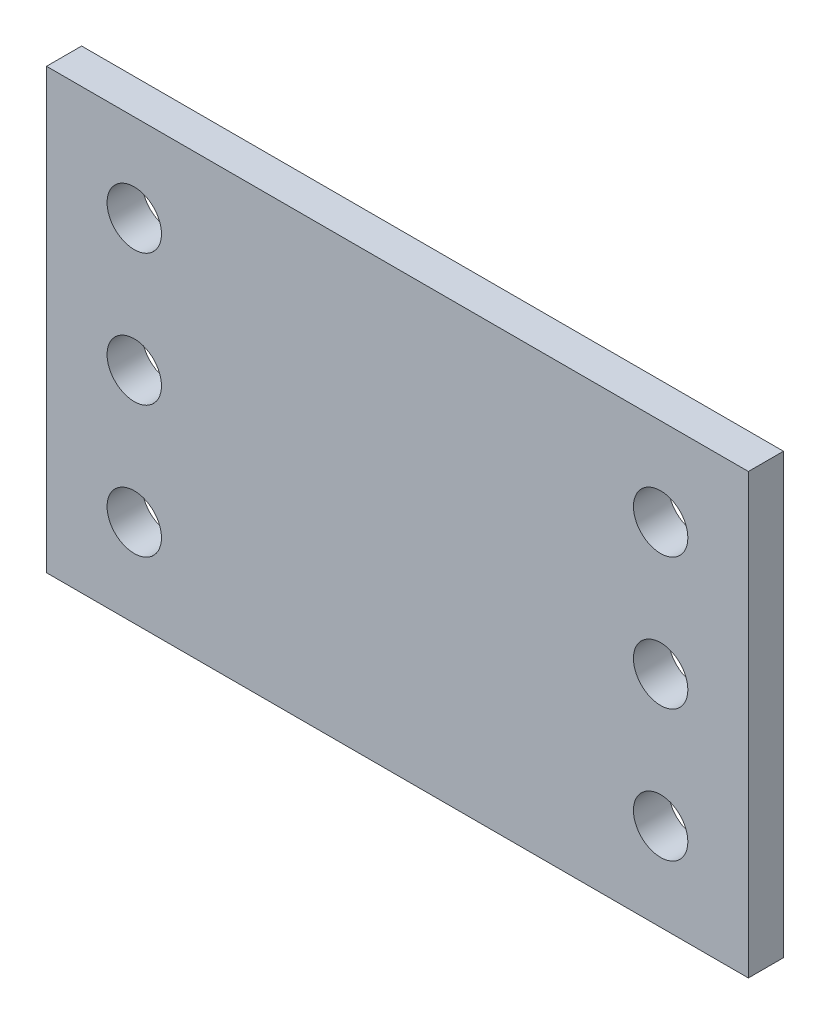
ISO-10303-21;
HEADER;
FILE_DESCRIPTION(('STEP AP214'),'2;1');
FILE_NAME('part.step','',(''),(''),'','','');
FILE_SCHEMA(('AUTOMOTIVE_DESIGN { 1 0 10303 214 1 1 1 1 }'));
ENDSEC;
DATA;
#1=APPLICATION_CONTEXT('core data for automotive mechanical design processes');
#2=APPLICATION_PROTOCOL_DEFINITION('international standard','automotive_design',2000,#1);
#3=PRODUCT_CONTEXT('',#1,'mechanical');
#4=PRODUCT('Part','Part','',(#3));
#5=PRODUCT_RELATED_PRODUCT_CATEGORY('part','',(#4));
#6=PRODUCT_DEFINITION_FORMATION('','',#4);
#7=PRODUCT_DEFINITION_CONTEXT('part definition',#1,'design');
#8=PRODUCT_DEFINITION('design','',#6,#7);
#9=PRODUCT_DEFINITION_SHAPE('','',#8);
#10=(LENGTH_UNIT() NAMED_UNIT(*) SI_UNIT(.MILLI.,.METRE.));
#11=(NAMED_UNIT(*) PLANE_ANGLE_UNIT() SI_UNIT($,.RADIAN.));
#12=(NAMED_UNIT(*) SI_UNIT($,.STERADIAN.) SOLID_ANGLE_UNIT());
#13=UNCERTAINTY_MEASURE_WITH_UNIT(LENGTH_MEASURE(1.E-05),#10,'distance_accuracy_value','');
#14=(GEOMETRIC_REPRESENTATION_CONTEXT(3) GLOBAL_UNCERTAINTY_ASSIGNED_CONTEXT((#13)) GLOBAL_UNIT_ASSIGNED_CONTEXT((#10,
#11,#12)) REPRESENTATION_CONTEXT('',''));
#15=CARTESIAN_POINT('',(0.,0.,0.));
#16=DIRECTION('',(0.,0.,1.));
#17=DIRECTION('',(1.,0.,0.));
#18=AXIS2_PLACEMENT_3D('',#15,#16,#17);
#19=CARTESIAN_POINT('',(20.,12.5,2.));
#20=DIRECTION('',(-1.,0.,0.));
#21=DIRECTION('',(0.,0.,1.));
#22=AXIS2_PLACEMENT_3D('',#19,#20,#21);
#23=PLANE('',#22);
#24=DIRECTION('',(0.,1.,0.));
#25=VECTOR('',#24,1.);
#26=CARTESIAN_POINT('',(20.,12.5,0.));
#27=LINE('',#26,#25);
#28=CARTESIAN_POINT('',(20.,-12.5,0.));
#29=VERTEX_POINT('',#28);
#30=CARTESIAN_POINT('',(20.,12.5,0.));
#31=VERTEX_POINT('',#30);
#32=EDGE_CURVE('E97',#29,#31,#27,.T.);
#33=ORIENTED_EDGE('',*,*,#32,.T.);
#34=DIRECTION('',(0.,0.,-1.));
#35=VECTOR('',#34,1.);
#36=CARTESIAN_POINT('',(20.,12.5,2.));
#37=LINE('',#36,#35);
#38=CARTESIAN_POINT('',(20.,12.5,2.));
#39=VERTEX_POINT('',#38);
#40=EDGE_CURVE('E11',#39,#31,#37,.T.);
#41=ORIENTED_EDGE('',*,*,#40,.F.);
#42=DIRECTION('',(0.,1.,0.));
#43=VECTOR('',#42,1.);
#44=CARTESIAN_POINT('',(20.,12.5,2.));
#45=LINE('',#44,#43);
#46=CARTESIAN_POINT('',(20.,-12.5,2.));
#47=VERTEX_POINT('',#46);
#48=EDGE_CURVE('E85',#47,#39,#45,.T.);
#49=ORIENTED_EDGE('',*,*,#48,.F.);
#50=DIRECTION('',(0.,0.,-1.));
#51=VECTOR('',#50,1.);
#52=CARTESIAN_POINT('',(20.,-12.5,2.));
#53=LINE('',#52,#51);
#54=EDGE_CURVE('E93',#47,#29,#53,.T.);
#55=ORIENTED_EDGE('',*,*,#54,.T.);
#56=EDGE_LOOP('',(#33,#41,#49,#55));
#57=FACE_BOUND('',#56,.T.);
#58=ADVANCED_FACE('F34',(#57),#23,.F.);
#59=CARTESIAN_POINT('',(-20.,12.5,2.));
#60=DIRECTION('',(0.,-1.,0.));
#61=DIRECTION('',(0.,0.,-1.));
#62=AXIS2_PLACEMENT_3D('',#59,#60,#61);
#63=PLANE('',#62);
#64=DIRECTION('',(-1.,0.,0.));
#65=VECTOR('',#64,1.);
#66=CARTESIAN_POINT('',(-20.,12.5,0.));
#67=LINE('',#66,#65);
#68=CARTESIAN_POINT('',(-20.,12.5,0.));
#69=VERTEX_POINT('',#68);
#70=EDGE_CURVE('E89',#31,#69,#67,.T.);
#71=ORIENTED_EDGE('',*,*,#70,.T.);
#72=DIRECTION('',(0.,0.,-1.));
#73=VECTOR('',#72,1.);
#74=CARTESIAN_POINT('',(-20.,12.5,2.));
#75=LINE('',#74,#73);
#76=CARTESIAN_POINT('',(-20.,12.5,2.));
#77=VERTEX_POINT('',#76);
#78=EDGE_CURVE('E42',#77,#69,#75,.T.);
#79=ORIENTED_EDGE('',*,*,#78,.F.);
#80=DIRECTION('',(-1.,0.,0.));
#81=VECTOR('',#80,1.);
#82=CARTESIAN_POINT('',(-20.,12.5,2.));
#83=LINE('',#82,#81);
#84=EDGE_CURVE('E80',#39,#77,#83,.T.);
#85=ORIENTED_EDGE('',*,*,#84,.F.);
#86=ORIENTED_EDGE('',*,*,#40,.T.);
#87=EDGE_LOOP('',(#71,#79,#85,#86));
#88=FACE_BOUND('',#87,.T.);
#89=ADVANCED_FACE('F88',(#88),#63,.F.);
#90=CARTESIAN_POINT('',(-20.,12.5,2.));
#91=DIRECTION('',(1.,0.,0.));
#92=DIRECTION('',(0.,0.,-1.));
#93=AXIS2_PLACEMENT_3D('',#90,#91,#92);
#94=PLANE('',#93);
#95=DIRECTION('',(0.,-1.,0.));
#96=VECTOR('',#95,1.);
#97=CARTESIAN_POINT('',(-20.,12.5,0.));
#98=LINE('',#97,#96);
#99=CARTESIAN_POINT('',(-20.,-12.5,0.));
#100=VERTEX_POINT('',#99);
#101=EDGE_CURVE('E67',#69,#100,#98,.T.);
#102=ORIENTED_EDGE('',*,*,#101,.T.);
#103=DIRECTION('',(0.,0.,-1.));
#104=VECTOR('',#103,1.);
#105=CARTESIAN_POINT('',(-20.,-12.5,2.));
#106=LINE('',#105,#104);
#107=CARTESIAN_POINT('',(-20.,-12.5,2.));
#108=VERTEX_POINT('',#107);
#109=EDGE_CURVE('E90',#108,#100,#106,.T.);
#110=ORIENTED_EDGE('',*,*,#109,.F.);
#111=DIRECTION('',(0.,-1.,0.));
#112=VECTOR('',#111,1.);
#113=CARTESIAN_POINT('',(-20.,12.5,2.));
#114=LINE('',#113,#112);
#115=EDGE_CURVE('E83',#77,#108,#114,.T.);
#116=ORIENTED_EDGE('',*,*,#115,.F.);
#117=ORIENTED_EDGE('',*,*,#78,.T.);
#118=EDGE_LOOP('',(#102,#110,#116,#117));
#119=FACE_BOUND('',#118,.T.);
#120=ADVANCED_FACE('F91',(#119),#94,.F.);
#121=CARTESIAN_POINT('',(-20.,-12.5,2.));
#122=DIRECTION('',(0.,1.,0.));
#123=DIRECTION('',(0.,0.,1.));
#124=AXIS2_PLACEMENT_3D('',#121,#122,#123);
#125=PLANE('',#124);
#126=DIRECTION('',(1.,0.,0.));
#127=VECTOR('',#126,1.);
#128=CARTESIAN_POINT('',(-20.,-12.5,0.));
#129=LINE('',#128,#127);
#130=EDGE_CURVE('E73',#100,#29,#129,.T.);
#131=ORIENTED_EDGE('',*,*,#130,.T.);
#132=ORIENTED_EDGE('',*,*,#54,.F.);
#133=DIRECTION('',(1.,0.,0.));
#134=VECTOR('',#133,1.);
#135=CARTESIAN_POINT('',(-20.,-12.5,2.));
#136=LINE('',#135,#134);
#137=EDGE_CURVE('E50',#108,#47,#136,.T.);
#138=ORIENTED_EDGE('',*,*,#137,.F.);
#139=ORIENTED_EDGE('',*,*,#109,.T.);
#140=EDGE_LOOP('',(#131,#132,#138,#139));
#141=FACE_BOUND('',#140,.T.);
#142=ADVANCED_FACE('F105',(#141),#125,.F.);
#143=CARTESIAN_POINT('',(0.,0.,2.));
#144=DIRECTION('',(0.,0.,1.));
#145=DIRECTION('',(1.,0.,0.));
#146=AXIS2_PLACEMENT_3D('',#143,#144,#145);
#147=PLANE('',#146);
#148=CARTESIAN_POINT('',(15.,7.5,2.));
#149=DIRECTION('',(0.,0.,1.));
#150=DIRECTION('',(-1.,0.,0.));
#151=AXIS2_PLACEMENT_3D('',#148,#149,#150);
#152=CIRCLE('',#151,1.55);
#153=CARTESIAN_POINT('',(13.45,7.5,2.));
#154=VERTEX_POINT('',#153);
#155=EDGE_CURVE('E121',#154,#154,#152,.T.);
#156=ORIENTED_EDGE('',*,*,#155,.F.);
#157=EDGE_LOOP('',(#156));
#158=FACE_BOUND('',#157,.T.);
#159=CARTESIAN_POINT('',(15.,0.,2.));
#160=DIRECTION('',(0.,0.,1.));
#161=DIRECTION('',(-1.,0.,0.));
#162=AXIS2_PLACEMENT_3D('',#159,#160,#161);
#163=CIRCLE('',#162,1.55);
#164=CARTESIAN_POINT('',(13.45,0.,2.));
#165=VERTEX_POINT('',#164);
#166=EDGE_CURVE('E120',#165,#165,#163,.T.);
#167=ORIENTED_EDGE('',*,*,#166,.F.);
#168=EDGE_LOOP('',(#167));
#169=FACE_BOUND('',#168,.T.);
#170=CARTESIAN_POINT('',(15.,-7.49999999999999,2.));
#171=DIRECTION('',(0.,0.,1.));
#172=DIRECTION('',(-1.,0.,0.));
#173=AXIS2_PLACEMENT_3D('',#170,#171,#172);
#174=CIRCLE('',#173,1.55);
#175=CARTESIAN_POINT('',(13.45,-7.49999999999999,2.));
#176=VERTEX_POINT('',#175);
#177=EDGE_CURVE('E127',#176,#176,#174,.T.);
#178=ORIENTED_EDGE('',*,*,#177,.F.);
#179=EDGE_LOOP('',(#178));
#180=FACE_BOUND('',#179,.T.);
#181=CARTESIAN_POINT('',(-15.,-7.5,2.));
#182=DIRECTION('',(0.,0.,1.));
#183=DIRECTION('',(1.,0.,0.));
#184=AXIS2_PLACEMENT_3D('',#181,#182,#183);
#185=CIRCLE('',#184,1.55);
#186=CARTESIAN_POINT('',(-13.45,-7.5,2.));
#187=VERTEX_POINT('',#186);
#188=EDGE_CURVE('E133',#187,#187,#185,.T.);
#189=ORIENTED_EDGE('',*,*,#188,.F.);
#190=EDGE_LOOP('',(#189));
#191=FACE_BOUND('',#190,.T.);
#192=CARTESIAN_POINT('',(-15.,0.,2.));
#193=DIRECTION('',(0.,0.,1.));
#194=DIRECTION('',(1.,0.,0.));
#195=AXIS2_PLACEMENT_3D('',#192,#193,#194);
#196=CIRCLE('',#195,1.55);
#197=CARTESIAN_POINT('',(-13.45,0.,2.));
#198=VERTEX_POINT('',#197);
#199=EDGE_CURVE('E139',#198,#198,#196,.T.);
#200=ORIENTED_EDGE('',*,*,#199,.F.);
#201=EDGE_LOOP('',(#200));
#202=FACE_BOUND('',#201,.T.);
#203=CARTESIAN_POINT('',(-15.,7.5,2.));
#204=DIRECTION('',(0.,0.,1.));
#205=DIRECTION('',(1.,0.,0.));
#206=AXIS2_PLACEMENT_3D('',#203,#204,#205);
#207=CIRCLE('',#206,1.55);
#208=CARTESIAN_POINT('',(-13.45,7.5,2.));
#209=VERTEX_POINT('',#208);
#210=EDGE_CURVE('E113',#209,#209,#207,.T.);
#211=ORIENTED_EDGE('',*,*,#210,.F.);
#212=EDGE_LOOP('',(#211));
#213=FACE_BOUND('',#212,.T.);
#214=ORIENTED_EDGE('',*,*,#48,.T.);
#215=ORIENTED_EDGE('',*,*,#84,.T.);
#216=ORIENTED_EDGE('',*,*,#115,.T.);
#217=ORIENTED_EDGE('',*,*,#137,.T.);
#218=EDGE_LOOP('',(#214,#215,#216,#217));
#219=FACE_BOUND('',#218,.T.);
#220=ADVANCED_FACE('F81',(#158,#169,#180,#191,#202,#213,#219),#147,.T.);
#221=CARTESIAN_POINT('',(0.,0.,0.));
#222=DIRECTION('',(0.,0.,1.));
#223=DIRECTION('',(1.,0.,0.));
#224=AXIS2_PLACEMENT_3D('',#221,#222,#223);
#225=PLANE('',#224);
#226=CARTESIAN_POINT('',(15.,7.5,0.));
#227=DIRECTION('',(0.,0.,1.));
#228=DIRECTION('',(1.,0.,0.));
#229=AXIS2_PLACEMENT_3D('',#226,#227,#228);
#230=CIRCLE('',#229,1.55);
#231=CARTESIAN_POINT('',(16.55,7.5,0.));
#232=VERTEX_POINT('',#231);
#233=EDGE_CURVE('E117',#232,#232,#230,.F.);
#234=ORIENTED_EDGE('',*,*,#233,.F.);
#235=EDGE_LOOP('',(#234));
#236=FACE_BOUND('',#235,.T.);
#237=CARTESIAN_POINT('',(15.,0.,0.));
#238=DIRECTION('',(0.,0.,1.));
#239=DIRECTION('',(1.,0.,0.));
#240=AXIS2_PLACEMENT_3D('',#237,#238,#239);
#241=CIRCLE('',#240,1.55);
#242=CARTESIAN_POINT('',(16.55,0.,0.));
#243=VERTEX_POINT('',#242);
#244=EDGE_CURVE('E124',#243,#243,#241,.F.);
#245=ORIENTED_EDGE('',*,*,#244,.F.);
#246=EDGE_LOOP('',(#245));
#247=FACE_BOUND('',#246,.T.);
#248=CARTESIAN_POINT('',(15.,-7.49999999999999,0.));
#249=DIRECTION('',(0.,0.,1.));
#250=DIRECTION('',(1.,0.,0.));
#251=AXIS2_PLACEMENT_3D('',#248,#249,#250);
#252=CIRCLE('',#251,1.55);
#253=CARTESIAN_POINT('',(16.55,-7.49999999999999,0.));
#254=VERTEX_POINT('',#253);
#255=EDGE_CURVE('E130',#254,#254,#252,.F.);
#256=ORIENTED_EDGE('',*,*,#255,.F.);
#257=EDGE_LOOP('',(#256));
#258=FACE_BOUND('',#257,.T.);
#259=CARTESIAN_POINT('',(-15.,-7.5,0.));
#260=DIRECTION('',(0.,0.,1.));
#261=DIRECTION('',(1.,0.,0.));
#262=AXIS2_PLACEMENT_3D('',#259,#260,#261);
#263=CIRCLE('',#262,1.55);
#264=CARTESIAN_POINT('',(-13.45,-7.5,0.));
#265=VERTEX_POINT('',#264);
#266=EDGE_CURVE('E136',#265,#265,#263,.F.);
#267=ORIENTED_EDGE('',*,*,#266,.F.);
#268=EDGE_LOOP('',(#267));
#269=FACE_BOUND('',#268,.T.);
#270=CARTESIAN_POINT('',(-15.,0.,0.));
#271=DIRECTION('',(0.,0.,1.));
#272=DIRECTION('',(1.,0.,0.));
#273=AXIS2_PLACEMENT_3D('',#270,#271,#272);
#274=CIRCLE('',#273,1.55);
#275=CARTESIAN_POINT('',(-13.45,0.,0.));
#276=VERTEX_POINT('',#275);
#277=EDGE_CURVE('E116',#276,#276,#274,.F.);
#278=ORIENTED_EDGE('',*,*,#277,.F.);
#279=EDGE_LOOP('',(#278));
#280=FACE_BOUND('',#279,.T.);
#281=CARTESIAN_POINT('',(-15.,7.5,0.));
#282=DIRECTION('',(0.,0.,1.));
#283=DIRECTION('',(1.,0.,0.));
#284=AXIS2_PLACEMENT_3D('',#281,#282,#283);
#285=CIRCLE('',#284,1.55);
#286=CARTESIAN_POINT('',(-13.45,7.5,0.));
#287=VERTEX_POINT('',#286);
#288=EDGE_CURVE('E100',#287,#287,#285,.F.);
#289=ORIENTED_EDGE('',*,*,#288,.F.);
#290=EDGE_LOOP('',(#289));
#291=FACE_BOUND('',#290,.T.);
#292=ORIENTED_EDGE('',*,*,#32,.F.);
#293=ORIENTED_EDGE('',*,*,#130,.F.);
#294=ORIENTED_EDGE('',*,*,#101,.F.);
#295=ORIENTED_EDGE('',*,*,#70,.F.);
#296=EDGE_LOOP('',(#292,#293,#294,#295));
#297=FACE_BOUND('',#296,.T.);
#298=ADVANCED_FACE('F108',(#236,#247,#258,#269,#280,#291,#297),#225,.F.);
#299=CARTESIAN_POINT('',(-15.,7.5,-0.00100000000000013));
#300=DIRECTION('',(0.,0.,1.));
#301=DIRECTION('',(1.,0.,0.));
#302=AXIS2_PLACEMENT_3D('',#299,#300,#301);
#303=CYLINDRICAL_SURFACE('',#302,1.55);
#304=ORIENTED_EDGE('',*,*,#210,.T.);
#305=EDGE_LOOP('',(#304));
#306=FACE_BOUND('',#305,.T.);
#307=ORIENTED_EDGE('',*,*,#288,.T.);
#308=EDGE_LOOP('',(#307));
#309=FACE_BOUND('',#308,.T.);
#310=ADVANCED_FACE('F156',(#306,#309),#303,.F.);
#311=CARTESIAN_POINT('',(-15.,0.,-0.00100000000000013));
#312=DIRECTION('',(0.,0.,1.));
#313=DIRECTION('',(1.,0.,0.));
#314=AXIS2_PLACEMENT_3D('',#311,#312,#313);
#315=CYLINDRICAL_SURFACE('',#314,1.55);
#316=ORIENTED_EDGE('',*,*,#199,.T.);
#317=EDGE_LOOP('',(#316));
#318=FACE_BOUND('',#317,.T.);
#319=ORIENTED_EDGE('',*,*,#277,.T.);
#320=EDGE_LOOP('',(#319));
#321=FACE_BOUND('',#320,.T.);
#322=ADVANCED_FACE('F147',(#318,#321),#315,.F.);
#323=CARTESIAN_POINT('',(-15.,-7.5,-0.00100000000000013));
#324=DIRECTION('',(0.,0.,1.));
#325=DIRECTION('',(1.,0.,0.));
#326=AXIS2_PLACEMENT_3D('',#323,#324,#325);
#327=CYLINDRICAL_SURFACE('',#326,1.55);
#328=ORIENTED_EDGE('',*,*,#188,.T.);
#329=EDGE_LOOP('',(#328));
#330=FACE_BOUND('',#329,.T.);
#331=ORIENTED_EDGE('',*,*,#266,.T.);
#332=EDGE_LOOP('',(#331));
#333=FACE_BOUND('',#332,.T.);
#334=ADVANCED_FACE('F206',(#330,#333),#327,.F.);
#335=CARTESIAN_POINT('',(15.,-7.49999999999999,-0.00100000000000013));
#336=DIRECTION('',(0.,0.,1.));
#337=DIRECTION('',(1.,0.,0.));
#338=AXIS2_PLACEMENT_3D('',#335,#336,#337);
#339=CYLINDRICAL_SURFACE('',#338,1.55);
#340=ORIENTED_EDGE('',*,*,#177,.T.);
#341=EDGE_LOOP('',(#340));
#342=FACE_BOUND('',#341,.T.);
#343=ORIENTED_EDGE('',*,*,#255,.T.);
#344=EDGE_LOOP('',(#343));
#345=FACE_BOUND('',#344,.T.);
#346=ADVANCED_FACE('F215',(#342,#345),#339,.F.);
#347=CARTESIAN_POINT('',(15.,0.,-0.00100000000000013));
#348=DIRECTION('',(0.,0.,1.));
#349=DIRECTION('',(1.,0.,0.));
#350=AXIS2_PLACEMENT_3D('',#347,#348,#349);
#351=CYLINDRICAL_SURFACE('',#350,1.55);
#352=ORIENTED_EDGE('',*,*,#166,.T.);
#353=EDGE_LOOP('',(#352));
#354=FACE_BOUND('',#353,.T.);
#355=ORIENTED_EDGE('',*,*,#244,.T.);
#356=EDGE_LOOP('',(#355));
#357=FACE_BOUND('',#356,.T.);
#358=ADVANCED_FACE('F225',(#354,#357),#351,.F.);
#359=CARTESIAN_POINT('',(15.,7.5,-0.00100000000000013));
#360=DIRECTION('',(0.,0.,1.));
#361=DIRECTION('',(1.,0.,0.));
#362=AXIS2_PLACEMENT_3D('',#359,#360,#361);
#363=CYLINDRICAL_SURFACE('',#362,1.55);
#364=ORIENTED_EDGE('',*,*,#155,.T.);
#365=EDGE_LOOP('',(#364));
#366=FACE_BOUND('',#365,.T.);
#367=ORIENTED_EDGE('',*,*,#233,.T.);
#368=EDGE_LOOP('',(#367));
#369=FACE_BOUND('',#368,.T.);
#370=ADVANCED_FACE('F235',(#366,#369),#363,.F.);
#371=CLOSED_SHELL('',(#58,#89,#120,#142,#220,#298,#310,#322,#334,#346,#358,#370));
#372=MANIFOLD_SOLID_BREP('B2',#371);
#373=ADVANCED_BREP_SHAPE_REPRESENTATION('',(#18,#372),#14);
#374=SHAPE_DEFINITION_REPRESENTATION(#9,#373);
ENDSEC;
END-ISO-10303-21;
